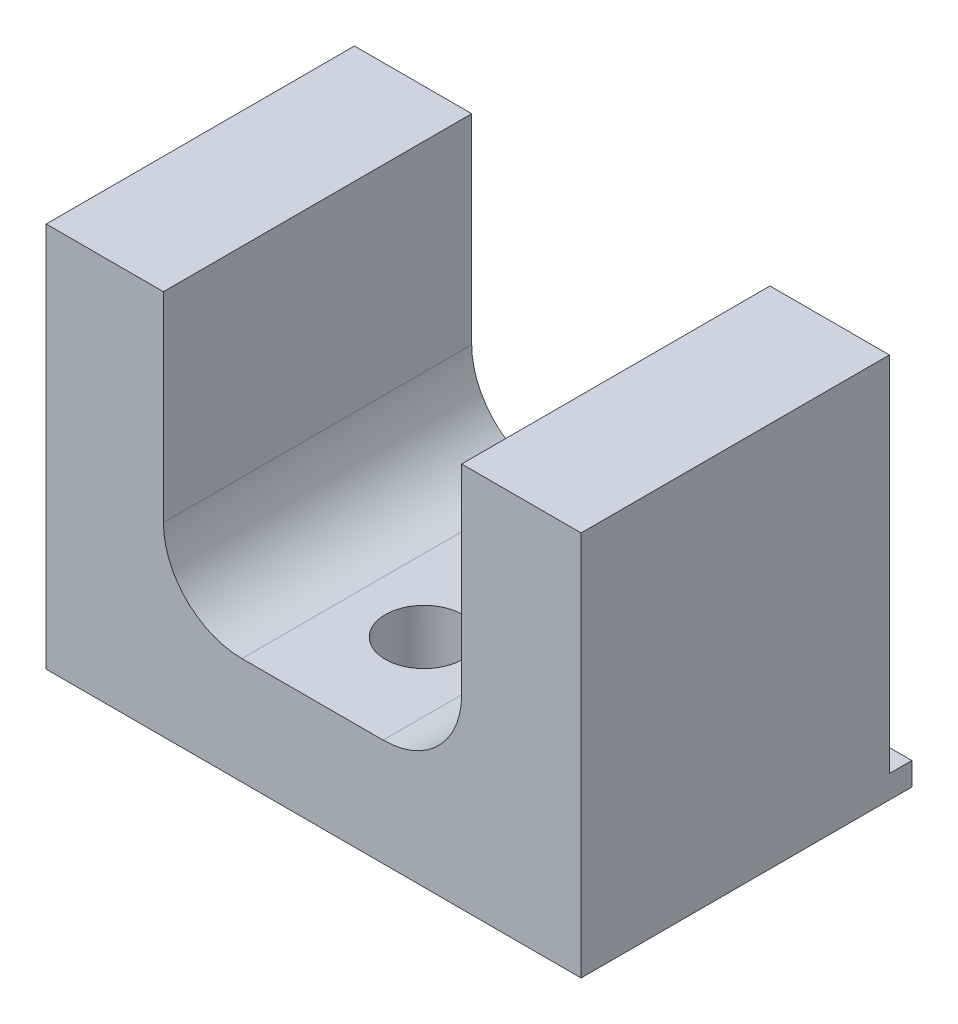
ISO-10303-21;
HEADER;
FILE_DESCRIPTION(('STEP AP214'),'2;1');
FILE_NAME('part.step','',(''),(''),'','','');
FILE_SCHEMA(('AUTOMOTIVE_DESIGN { 1 0 10303 214 1 1 1 1 }'));
ENDSEC;
DATA;
#1=APPLICATION_CONTEXT('core data for automotive mechanical design processes');
#2=APPLICATION_PROTOCOL_DEFINITION('international standard','automotive_design',2000,#1);
#3=PRODUCT_CONTEXT('',#1,'mechanical');
#4=PRODUCT('Part','Part','',(#3));
#5=PRODUCT_RELATED_PRODUCT_CATEGORY('part','',(#4));
#6=PRODUCT_DEFINITION_FORMATION('','',#4);
#7=PRODUCT_DEFINITION_CONTEXT('part definition',#1,'design');
#8=PRODUCT_DEFINITION('design','',#6,#7);
#9=PRODUCT_DEFINITION_SHAPE('','',#8);
#10=(LENGTH_UNIT() NAMED_UNIT(*) SI_UNIT(.MILLI.,.METRE.));
#11=(NAMED_UNIT(*) PLANE_ANGLE_UNIT() SI_UNIT($,.RADIAN.));
#12=(NAMED_UNIT(*) SI_UNIT($,.STERADIAN.) SOLID_ANGLE_UNIT());
#13=UNCERTAINTY_MEASURE_WITH_UNIT(LENGTH_MEASURE(1.E-05),#10,'distance_accuracy_value','');
#14=(GEOMETRIC_REPRESENTATION_CONTEXT(3) GLOBAL_UNCERTAINTY_ASSIGNED_CONTEXT((#13)) GLOBAL_UNIT_ASSIGNED_CONTEXT((#10,
#11,#12)) REPRESENTATION_CONTEXT('',''));
#15=CARTESIAN_POINT('',(0.,0.,0.));
#16=DIRECTION('',(0.,0.,1.));
#17=DIRECTION('',(1.,0.,0.));
#18=AXIS2_PLACEMENT_3D('',#15,#16,#17);
#19=CARTESIAN_POINT('',(0.,0.,-45.11));
#20=DIRECTION('',(-1.,0.,0.));
#21=DIRECTION('',(0.,0.,1.));
#22=AXIS2_PLACEMENT_3D('',#19,#20,#21);
#23=PLANE('',#22);
#24=DIRECTION('',(0.,0.,1.));
#25=VECTOR('',#24,1.);
#26=CARTESIAN_POINT('',(0.,52.58,-45.11));
#27=LINE('',#26,#25);
#28=CARTESIAN_POINT('',(0.,52.58,-42.05));
#29=VERTEX_POINT('',#28);
#30=CARTESIAN_POINT('',(0.,52.58,0.));
#31=VERTEX_POINT('',#30);
#32=EDGE_CURVE('E57',#29,#31,#27,.T.);
#33=ORIENTED_EDGE('',*,*,#32,.F.);
#34=DIRECTION('',(0.,-1.,0.));
#35=VECTOR('',#34,1.);
#36=CARTESIAN_POINT('',(0.,0.,-42.05));
#37=LINE('',#36,#35);
#38=CARTESIAN_POINT('',(0.,3.13,-42.05));
#39=VERTEX_POINT('',#38);
#40=EDGE_CURVE('E131',#29,#39,#37,.T.);
#41=ORIENTED_EDGE('',*,*,#40,.T.);
#42=DIRECTION('',(0.,0.,-1.));
#43=VECTOR('',#42,1.);
#44=CARTESIAN_POINT('',(0.,3.13,-45.11));
#45=LINE('',#44,#43);
#46=CARTESIAN_POINT('',(0.,3.13,-45.11));
#47=VERTEX_POINT('',#46);
#48=EDGE_CURVE('E326',#39,#47,#45,.T.);
#49=ORIENTED_EDGE('',*,*,#48,.T.);
#50=DIRECTION('',(0.,-1.,0.));
#51=VECTOR('',#50,1.);
#52=CARTESIAN_POINT('',(0.,0.,-45.11));
#53=LINE('',#52,#51);
#54=CARTESIAN_POINT('',(0.,0.,-45.11));
#55=VERTEX_POINT('',#54);
#56=EDGE_CURVE('E139',#47,#55,#53,.T.);
#57=ORIENTED_EDGE('',*,*,#56,.T.);
#58=DIRECTION('',(0.,0.,1.));
#59=VECTOR('',#58,1.);
#60=CARTESIAN_POINT('',(0.,0.,-45.11));
#61=LINE('',#60,#59);
#62=CARTESIAN_POINT('',(0.,0.,0.));
#63=VERTEX_POINT('',#62);
#64=EDGE_CURVE('E125',#55,#63,#61,.T.);
#65=ORIENTED_EDGE('',*,*,#64,.T.);
#66=DIRECTION('',(0.,-1.,0.));
#67=VECTOR('',#66,1.);
#68=CARTESIAN_POINT('',(0.,0.,0.));
#69=LINE('',#68,#67);
#70=EDGE_CURVE('E123',#31,#63,#69,.T.);
#71=ORIENTED_EDGE('',*,*,#70,.F.);
#72=EDGE_LOOP('',(#33,#41,#49,#57,#65,#71));
#73=FACE_BOUND('',#72,.T.);
#74=ADVANCED_FACE('F49',(#73),#23,.T.);
#75=CARTESIAN_POINT('',(0.,52.58,-45.11));
#76=DIRECTION('',(0.,1.,0.));
#77=DIRECTION('',(0.,0.,1.));
#78=AXIS2_PLACEMENT_3D('',#75,#76,#77);
#79=PLANE('',#78);
#80=DIRECTION('',(0.,0.,1.));
#81=VECTOR('',#80,1.);
#82=CARTESIAN_POINT('',(15.99,52.58,-45.11));
#83=LINE('',#82,#81);
#84=CARTESIAN_POINT('',(15.99,52.58,-42.05));
#85=VERTEX_POINT('',#84);
#86=CARTESIAN_POINT('',(15.99,52.58,0.));
#87=VERTEX_POINT('',#86);
#88=EDGE_CURVE('E120',#85,#87,#83,.T.);
#89=ORIENTED_EDGE('',*,*,#88,.F.);
#90=DIRECTION('',(-1.,0.,0.));
#91=VECTOR('',#90,1.);
#92=CARTESIAN_POINT('',(0.,52.58,-42.05));
#93=LINE('',#92,#91);
#94=EDGE_CURVE('E116',#85,#29,#93,.T.);
#95=ORIENTED_EDGE('',*,*,#94,.T.);
#96=ORIENTED_EDGE('',*,*,#32,.T.);
#97=DIRECTION('',(-1.,0.,0.));
#98=VECTOR('',#97,1.);
#99=CARTESIAN_POINT('',(0.,52.58,0.));
#100=LINE('',#99,#98);
#101=EDGE_CURVE('E114',#87,#31,#100,.T.);
#102=ORIENTED_EDGE('',*,*,#101,.F.);
#103=EDGE_LOOP('',(#89,#95,#96,#102));
#104=FACE_BOUND('',#103,.T.);
#105=ADVANCED_FACE('F112',(#104),#79,.T.);
#106=CARTESIAN_POINT('',(15.99,52.58,-45.11));
#107=DIRECTION('',(1.,0.,0.));
#108=DIRECTION('',(0.,1.,0.));
#109=AXIS2_PLACEMENT_3D('',#106,#107,#108);
#110=PLANE('',#109);
#111=DIRECTION('',(0.,0.,1.));
#112=VECTOR('',#111,1.);
#113=CARTESIAN_POINT('',(15.99,25.31,-45.11));
#114=LINE('',#113,#112);
#115=CARTESIAN_POINT('',(15.99,25.31,-42.05));
#116=VERTEX_POINT('',#115);
#117=CARTESIAN_POINT('',(15.99,25.31,0.));
#118=VERTEX_POINT('',#117);
#119=EDGE_CURVE('E151',#116,#118,#114,.T.);
#120=ORIENTED_EDGE('',*,*,#119,.F.);
#121=DIRECTION('',(0.,1.,0.));
#122=VECTOR('',#121,1.);
#123=CARTESIAN_POINT('',(15.99,52.58,-42.05));
#124=LINE('',#123,#122);
#125=EDGE_CURVE('E216',#116,#85,#124,.T.);
#126=ORIENTED_EDGE('',*,*,#125,.T.);
#127=ORIENTED_EDGE('',*,*,#88,.T.);
#128=DIRECTION('',(0.,1.,0.));
#129=VECTOR('',#128,1.);
#130=CARTESIAN_POINT('',(15.99,52.58,0.));
#131=LINE('',#130,#129);
#132=EDGE_CURVE('E137',#118,#87,#131,.T.);
#133=ORIENTED_EDGE('',*,*,#132,.F.);
#134=EDGE_LOOP('',(#120,#126,#127,#133));
#135=FACE_BOUND('',#134,.T.);
#136=ADVANCED_FACE('F213',(#135),#110,.T.);
#137=CARTESIAN_POINT('',(26.7,25.31,-45.11));
#138=DIRECTION('',(0.,0.,1.));
#139=DIRECTION('',(1.,0.,0.));
#140=AXIS2_PLACEMENT_3D('',#137,#138,#139);
#141=CYLINDRICAL_SURFACE('',#140,10.71);
#142=DIRECTION('',(0.,0.,1.));
#143=VECTOR('',#142,1.);
#144=CARTESIAN_POINT('',(26.7,14.6,-45.11));
#145=LINE('',#144,#143);
#146=CARTESIAN_POINT('',(26.7,14.6,-42.05));
#147=VERTEX_POINT('',#146);
#148=CARTESIAN_POINT('',(26.7,14.6,0.));
#149=VERTEX_POINT('',#148);
#150=EDGE_CURVE('E154',#147,#149,#145,.T.);
#151=ORIENTED_EDGE('',*,*,#150,.F.);
#152=CARTESIAN_POINT('',(26.7,25.31,-42.05));
#153=DIRECTION('',(0.,0.,-1.));
#154=DIRECTION('',(-1.,0.,0.));
#155=AXIS2_PLACEMENT_3D('',#152,#153,#154);
#156=CIRCLE('',#155,10.71);
#157=EDGE_CURVE('E210',#147,#116,#156,.T.);
#158=ORIENTED_EDGE('',*,*,#157,.T.);
#159=ORIENTED_EDGE('',*,*,#119,.T.);
#160=CARTESIAN_POINT('',(26.7,25.31,0.));
#161=DIRECTION('',(0.,0.,-1.));
#162=DIRECTION('',(1.,0.,0.));
#163=AXIS2_PLACEMENT_3D('',#160,#161,#162);
#164=CIRCLE('',#163,10.71);
#165=EDGE_CURVE('E145',#149,#118,#164,.T.);
#166=ORIENTED_EDGE('',*,*,#165,.F.);
#167=EDGE_LOOP('',(#151,#158,#159,#166));
#168=FACE_BOUND('',#167,.T.);
#169=ADVANCED_FACE('F204',(#168),#141,.F.);
#170=CARTESIAN_POINT('',(26.7,14.6,-45.11));
#171=DIRECTION('',(0.,1.,0.));
#172=DIRECTION('',(-1.,0.,0.));
#173=AXIS2_PLACEMENT_3D('',#170,#171,#172);
#174=PLANE('',#173);
#175=CARTESIAN_POINT('',(36.57,14.6,-14.97));
#176=DIRECTION('',(0.,1.,0.));
#177=DIRECTION('',(-1.,0.,0.));
#178=AXIS2_PLACEMENT_3D('',#175,#176,#177);
#179=CIRCLE('',#178,5.29);
#180=CARTESIAN_POINT('',(31.28,14.6,-14.97));
#181=VERTEX_POINT('',#180);
#182=EDGE_CURVE('E313',#181,#181,#179,.T.);
#183=ORIENTED_EDGE('',*,*,#182,.F.);
#184=EDGE_LOOP('',(#183));
#185=FACE_BOUND('',#184,.T.);
#186=DIRECTION('',(0.,0.,1.));
#187=VECTOR('',#186,1.);
#188=CARTESIAN_POINT('',(45.96,14.6,-45.11));
#189=LINE('',#188,#187);
#190=CARTESIAN_POINT('',(45.96,14.6,-42.05));
#191=VERTEX_POINT('',#190);
#192=CARTESIAN_POINT('',(45.96,14.6,0.));
#193=VERTEX_POINT('',#192);
#194=EDGE_CURVE('E157',#191,#193,#189,.T.);
#195=ORIENTED_EDGE('',*,*,#194,.F.);
#196=DIRECTION('',(-1.,0.,0.));
#197=VECTOR('',#196,1.);
#198=CARTESIAN_POINT('',(26.7,14.6,-42.05));
#199=LINE('',#198,#197);
#200=EDGE_CURVE('E342',#191,#147,#199,.T.);
#201=ORIENTED_EDGE('',*,*,#200,.T.);
#202=ORIENTED_EDGE('',*,*,#150,.T.);
#203=DIRECTION('',(-1.,0.,0.));
#204=VECTOR('',#203,1.);
#205=CARTESIAN_POINT('',(26.7,14.6,0.));
#206=LINE('',#205,#204);
#207=EDGE_CURVE('E196',#193,#149,#206,.T.);
#208=ORIENTED_EDGE('',*,*,#207,.F.);
#209=EDGE_LOOP('',(#195,#201,#202,#208));
#210=FACE_BOUND('',#209,.T.);
#211=ADVANCED_FACE('F378',(#185,#210),#174,.T.);
#212=CARTESIAN_POINT('',(45.96,25.31,-45.11));
#213=DIRECTION('',(0.,0.,1.));
#214=DIRECTION('',(1.,0.,0.));
#215=AXIS2_PLACEMENT_3D('',#212,#213,#214);
#216=CYLINDRICAL_SURFACE('',#215,10.71);
#217=DIRECTION('',(0.,0.,1.));
#218=VECTOR('',#217,1.);
#219=CARTESIAN_POINT('',(56.67,25.31,-45.11));
#220=LINE('',#219,#218);
#221=CARTESIAN_POINT('',(56.67,25.31,-42.05));
#222=VERTEX_POINT('',#221);
#223=CARTESIAN_POINT('',(56.67,25.31,0.));
#224=VERTEX_POINT('',#223);
#225=EDGE_CURVE('E160',#222,#224,#220,.T.);
#226=ORIENTED_EDGE('',*,*,#225,.F.);
#227=CARTESIAN_POINT('',(45.96,25.31,-42.05));
#228=DIRECTION('',(0.,0.,-1.));
#229=DIRECTION('',(-1.,0.,0.));
#230=AXIS2_PLACEMENT_3D('',#227,#228,#229);
#231=CIRCLE('',#230,10.71);
#232=EDGE_CURVE('E338',#222,#191,#231,.T.);
#233=ORIENTED_EDGE('',*,*,#232,.T.);
#234=ORIENTED_EDGE('',*,*,#194,.T.);
#235=CARTESIAN_POINT('',(45.96,25.31,0.));
#236=DIRECTION('',(0.,0.,-1.));
#237=DIRECTION('',(1.,0.,0.));
#238=AXIS2_PLACEMENT_3D('',#235,#236,#237);
#239=CIRCLE('',#238,10.71);
#240=EDGE_CURVE('E192',#224,#193,#239,.T.);
#241=ORIENTED_EDGE('',*,*,#240,.F.);
#242=EDGE_LOOP('',(#226,#233,#234,#241));
#243=FACE_BOUND('',#242,.T.);
#244=ADVANCED_FACE('F375',(#243),#216,.F.);
#245=CARTESIAN_POINT('',(56.67,25.31,-45.11));
#246=DIRECTION('',(-1.,0.,0.));
#247=DIRECTION('',(0.,-1.,0.));
#248=AXIS2_PLACEMENT_3D('',#245,#246,#247);
#249=PLANE('',#248);
#250=DIRECTION('',(0.,0.,1.));
#251=VECTOR('',#250,1.);
#252=CARTESIAN_POINT('',(56.67,52.57,-45.11));
#253=LINE('',#252,#251);
#254=CARTESIAN_POINT('',(56.67,52.57,-42.05));
#255=VERTEX_POINT('',#254);
#256=CARTESIAN_POINT('',(56.67,52.57,0.));
#257=VERTEX_POINT('',#256);
#258=EDGE_CURVE('E163',#255,#257,#253,.T.);
#259=ORIENTED_EDGE('',*,*,#258,.F.);
#260=DIRECTION('',(0.,-1.,0.));
#261=VECTOR('',#260,1.);
#262=CARTESIAN_POINT('',(56.67,25.31,-42.05));
#263=LINE('',#262,#261);
#264=EDGE_CURVE('E334',#255,#222,#263,.T.);
#265=ORIENTED_EDGE('',*,*,#264,.T.);
#266=ORIENTED_EDGE('',*,*,#225,.T.);
#267=DIRECTION('',(0.,-1.,0.));
#268=VECTOR('',#267,1.);
#269=CARTESIAN_POINT('',(56.67,25.31,0.));
#270=LINE('',#269,#268);
#271=EDGE_CURVE('E188',#257,#224,#270,.T.);
#272=ORIENTED_EDGE('',*,*,#271,.F.);
#273=EDGE_LOOP('',(#259,#265,#266,#272));
#274=FACE_BOUND('',#273,.T.);
#275=ADVANCED_FACE('F371',(#274),#249,.T.);
#276=CARTESIAN_POINT('',(56.67,52.57,-45.11));
#277=DIRECTION('',(0.,1.,0.));
#278=DIRECTION('',(0.,0.,1.));
#279=AXIS2_PLACEMENT_3D('',#276,#277,#278);
#280=PLANE('',#279);
#281=DIRECTION('',(0.,0.,1.));
#282=VECTOR('',#281,1.);
#283=CARTESIAN_POINT('',(72.96,52.57,-45.11));
#284=LINE('',#283,#282);
#285=CARTESIAN_POINT('',(72.96,52.57,-42.05));
#286=VERTEX_POINT('',#285);
#287=CARTESIAN_POINT('',(72.96,52.57,0.));
#288=VERTEX_POINT('',#287);
#289=EDGE_CURVE('E166',#286,#288,#284,.T.);
#290=ORIENTED_EDGE('',*,*,#289,.F.);
#291=DIRECTION('',(-1.,0.,0.));
#292=VECTOR('',#291,1.);
#293=CARTESIAN_POINT('',(56.67,52.57,-42.05));
#294=LINE('',#293,#292);
#295=EDGE_CURVE('E330',#286,#255,#294,.T.);
#296=ORIENTED_EDGE('',*,*,#295,.T.);
#297=ORIENTED_EDGE('',*,*,#258,.T.);
#298=DIRECTION('',(-1.,0.,0.));
#299=VECTOR('',#298,1.);
#300=CARTESIAN_POINT('',(56.67,52.57,0.));
#301=LINE('',#300,#299);
#302=EDGE_CURVE('E184',#288,#257,#301,.T.);
#303=ORIENTED_EDGE('',*,*,#302,.F.);
#304=EDGE_LOOP('',(#290,#296,#297,#303));
#305=FACE_BOUND('',#304,.T.);
#306=ADVANCED_FACE('F367',(#305),#280,.T.);
#307=CARTESIAN_POINT('',(72.96,52.57,-45.11));
#308=DIRECTION('',(1.,0.,0.));
#309=DIRECTION('',(0.,0.,-1.));
#310=AXIS2_PLACEMENT_3D('',#307,#308,#309);
#311=PLANE('',#310);
#312=DIRECTION('',(0.,0.,1.));
#313=VECTOR('',#312,1.);
#314=CARTESIAN_POINT('',(72.96,3.13,-45.11));
#315=LINE('',#314,#313);
#316=CARTESIAN_POINT('',(72.96,3.13,-45.11));
#317=VERTEX_POINT('',#316);
#318=CARTESIAN_POINT('',(72.96,3.13,-42.05));
#319=VERTEX_POINT('',#318);
#320=EDGE_CURVE('E63',#317,#319,#315,.T.);
#321=ORIENTED_EDGE('',*,*,#320,.T.);
#322=DIRECTION('',(0.,1.,0.));
#323=VECTOR('',#322,1.);
#324=CARTESIAN_POINT('',(72.96,52.57,-42.05));
#325=LINE('',#324,#323);
#326=EDGE_CURVE('E319',#319,#286,#325,.T.);
#327=ORIENTED_EDGE('',*,*,#326,.T.);
#328=ORIENTED_EDGE('',*,*,#289,.T.);
#329=DIRECTION('',(0.,1.,0.));
#330=VECTOR('',#329,1.);
#331=CARTESIAN_POINT('',(72.96,52.57,0.));
#332=LINE('',#331,#330);
#333=CARTESIAN_POINT('',(72.96,0.,0.));
#334=VERTEX_POINT('',#333);
#335=EDGE_CURVE('E180',#334,#288,#332,.T.);
#336=ORIENTED_EDGE('',*,*,#335,.F.);
#337=DIRECTION('',(0.,0.,1.));
#338=VECTOR('',#337,1.);
#339=CARTESIAN_POINT('',(72.96,0.,-45.11));
#340=LINE('',#339,#338);
#341=CARTESIAN_POINT('',(72.96,0.,-45.11));
#342=VERTEX_POINT('',#341);
#343=EDGE_CURVE('E72',#342,#334,#340,.T.);
#344=ORIENTED_EDGE('',*,*,#343,.F.);
#345=DIRECTION('',(0.,1.,0.));
#346=VECTOR('',#345,1.);
#347=CARTESIAN_POINT('',(72.96,52.57,-45.11));
#348=LINE('',#347,#346);
#349=EDGE_CURVE('E171',#342,#317,#348,.T.);
#350=ORIENTED_EDGE('',*,*,#349,.T.);
#351=EDGE_LOOP('',(#321,#327,#328,#336,#344,#350));
#352=FACE_BOUND('',#351,.T.);
#353=ADVANCED_FACE('F364',(#352),#311,.T.);
#354=CARTESIAN_POINT('',(26.7,25.31,-45.11));
#355=DIRECTION('',(0.,0.,1.));
#356=DIRECTION('',(1.,0.,0.));
#357=AXIS2_PLACEMENT_3D('',#354,#355,#356);
#358=PLANE('',#357);
#359=DIRECTION('',(-1.,0.,0.));
#360=VECTOR('',#359,1.);
#361=CARTESIAN_POINT('',(26.7,3.13,-45.11));
#362=LINE('',#361,#360);
#363=EDGE_CURVE('E11',#317,#47,#362,.T.);
#364=ORIENTED_EDGE('',*,*,#363,.F.);
#365=ORIENTED_EDGE('',*,*,#349,.F.);
#366=DIRECTION('',(1.,0.,0.));
#367=VECTOR('',#366,1.);
#368=CARTESIAN_POINT('',(0.,0.,-45.11));
#369=LINE('',#368,#367);
#370=EDGE_CURVE('E143',#55,#342,#369,.T.);
#371=ORIENTED_EDGE('',*,*,#370,.F.);
#372=ORIENTED_EDGE('',*,*,#56,.F.);
#373=EDGE_LOOP('',(#364,#365,#371,#372));
#374=FACE_BOUND('',#373,.T.);
#375=ADVANCED_FACE('F359',(#374),#358,.F.);
#376=CARTESIAN_POINT('',(0.,0.,-45.11));
#377=DIRECTION('',(0.,-1.,0.));
#378=DIRECTION('',(0.,0.,-1.));
#379=AXIS2_PLACEMENT_3D('',#376,#377,#378);
#380=PLANE('',#379);
#381=CARTESIAN_POINT('',(36.57,0.,-14.97));
#382=DIRECTION('',(0.,-1.,0.));
#383=DIRECTION('',(0.,0.,-1.));
#384=AXIS2_PLACEMENT_3D('',#381,#382,#383);
#385=CIRCLE('',#384,5.29);
#386=CARTESIAN_POINT('',(36.57,0.,-20.26));
#387=VERTEX_POINT('',#386);
#388=EDGE_CURVE('E309',#387,#387,#385,.T.);
#389=ORIENTED_EDGE('',*,*,#388,.F.);
#390=EDGE_LOOP('',(#389));
#391=FACE_BOUND('',#390,.T.);
#392=DIRECTION('',(1.,0.,0.));
#393=VECTOR('',#392,1.);
#394=CARTESIAN_POINT('',(0.,0.,0.));
#395=LINE('',#394,#393);
#396=EDGE_CURVE('E130',#63,#334,#395,.T.);
#397=ORIENTED_EDGE('',*,*,#396,.F.);
#398=ORIENTED_EDGE('',*,*,#64,.F.);
#399=ORIENTED_EDGE('',*,*,#370,.T.);
#400=ORIENTED_EDGE('',*,*,#343,.T.);
#401=EDGE_LOOP('',(#397,#398,#399,#400));
#402=FACE_BOUND('',#401,.T.);
#403=ADVANCED_FACE('F362',(#391,#402),#380,.T.);
#404=CARTESIAN_POINT('',(26.7,25.31,0.));
#405=DIRECTION('',(0.,0.,1.));
#406=DIRECTION('',(1.,0.,0.));
#407=AXIS2_PLACEMENT_3D('',#404,#405,#406);
#408=PLANE('',#407);
#409=ORIENTED_EDGE('',*,*,#70,.T.);
#410=ORIENTED_EDGE('',*,*,#396,.T.);
#411=ORIENTED_EDGE('',*,*,#335,.T.);
#412=ORIENTED_EDGE('',*,*,#302,.T.);
#413=ORIENTED_EDGE('',*,*,#271,.T.);
#414=ORIENTED_EDGE('',*,*,#240,.T.);
#415=ORIENTED_EDGE('',*,*,#207,.T.);
#416=ORIENTED_EDGE('',*,*,#165,.T.);
#417=ORIENTED_EDGE('',*,*,#132,.T.);
#418=ORIENTED_EDGE('',*,*,#101,.T.);
#419=EDGE_LOOP('',(#409,#410,#411,#412,#413,#414,#415,#416,#417,#418));
#420=FACE_BOUND('',#419,.T.);
#421=ADVANCED_FACE('F134',(#420),#408,.T.);
#422=CARTESIAN_POINT('',(-27.04,52.57,-42.05));
#423=DIRECTION('',(0.,0.,-1.));
#424=DIRECTION('',(-1.,0.,0.));
#425=AXIS2_PLACEMENT_3D('',#422,#423,#424);
#426=PLANE('',#425);
#427=CARTESIAN_POINT('',(62.965,42.405,-42.05));
#428=DIRECTION('',(0.,0.,-1.));
#429=DIRECTION('',(-1.,0.,0.));
#430=AXIS2_PLACEMENT_3D('',#427,#428,#429);
#431=CIRCLE('',#430,2.525);
#432=CARTESIAN_POINT('',(60.44,42.405,-42.05));
#433=VERTEX_POINT('',#432);
#434=EDGE_CURVE('E274',#433,#433,#431,.T.);
#435=ORIENTED_EDGE('',*,*,#434,.F.);
#436=EDGE_LOOP('',(#435));
#437=FACE_BOUND('',#436,.T.);
#438=CARTESIAN_POINT('',(62.965,7.5,-42.05));
#439=DIRECTION('',(0.,0.,-1.));
#440=DIRECTION('',(-1.,0.,0.));
#441=AXIS2_PLACEMENT_3D('',#438,#439,#440);
#442=CIRCLE('',#441,2.525);
#443=CARTESIAN_POINT('',(60.44,7.5,-42.05));
#444=VERTEX_POINT('',#443);
#445=EDGE_CURVE('E265',#444,#444,#442,.T.);
#446=ORIENTED_EDGE('',*,*,#445,.F.);
#447=EDGE_LOOP('',(#446));
#448=FACE_BOUND('',#447,.T.);
#449=CARTESIAN_POINT('',(10.06,7.5,-42.05));
#450=DIRECTION('',(0.,0.,-1.));
#451=DIRECTION('',(-1.,0.,0.));
#452=AXIS2_PLACEMENT_3D('',#449,#450,#451);
#453=CIRCLE('',#452,2.525);
#454=CARTESIAN_POINT('',(7.535,7.5,-42.05));
#455=VERTEX_POINT('',#454);
#456=EDGE_CURVE('E285',#455,#455,#453,.T.);
#457=ORIENTED_EDGE('',*,*,#456,.F.);
#458=EDGE_LOOP('',(#457));
#459=FACE_BOUND('',#458,.T.);
#460=CARTESIAN_POINT('',(10.06,42.405,-42.05));
#461=DIRECTION('',(0.,0.,-1.));
#462=DIRECTION('',(-1.,0.,0.));
#463=AXIS2_PLACEMENT_3D('',#460,#461,#462);
#464=CIRCLE('',#463,2.525);
#465=CARTESIAN_POINT('',(7.53500000000001,42.405,-42.05));
#466=VERTEX_POINT('',#465);
#467=EDGE_CURVE('E297',#466,#466,#464,.T.);
#468=ORIENTED_EDGE('',*,*,#467,.F.);
#469=EDGE_LOOP('',(#468));
#470=FACE_BOUND('',#469,.T.);
#471=ORIENTED_EDGE('',*,*,#94,.F.);
#472=ORIENTED_EDGE('',*,*,#125,.F.);
#473=ORIENTED_EDGE('',*,*,#157,.F.);
#474=ORIENTED_EDGE('',*,*,#200,.F.);
#475=ORIENTED_EDGE('',*,*,#232,.F.);
#476=ORIENTED_EDGE('',*,*,#264,.F.);
#477=ORIENTED_EDGE('',*,*,#295,.F.);
#478=ORIENTED_EDGE('',*,*,#326,.F.);
#479=DIRECTION('',(1.,0.,0.));
#480=VECTOR('',#479,1.);
#481=CARTESIAN_POINT('',(-27.04,3.13,-42.05));
#482=LINE('',#481,#480);
#483=EDGE_CURVE('E323',#39,#319,#482,.T.);
#484=ORIENTED_EDGE('',*,*,#483,.F.);
#485=ORIENTED_EDGE('',*,*,#40,.F.);
#486=EDGE_LOOP('',(#471,#472,#473,#474,#475,#476,#477,#478,#484,#485));
#487=FACE_BOUND('',#486,.T.);
#488=ADVANCED_FACE('F355',(#437,#448,#459,#470,#487),#426,.T.);
#489=CARTESIAN_POINT('',(-27.04,3.13,-45.11));
#490=DIRECTION('',(0.,1.,0.));
#491=DIRECTION('',(0.,0.,1.));
#492=AXIS2_PLACEMENT_3D('',#489,#490,#491);
#493=PLANE('',#492);
#494=ORIENTED_EDGE('',*,*,#483,.T.);
#495=ORIENTED_EDGE('',*,*,#320,.F.);
#496=ORIENTED_EDGE('',*,*,#363,.T.);
#497=ORIENTED_EDGE('',*,*,#48,.F.);
#498=EDGE_LOOP('',(#494,#495,#496,#497));
#499=FACE_BOUND('',#498,.T.);
#500=ADVANCED_FACE('F357',(#499),#493,.T.);
#501=CARTESIAN_POINT('',(36.57,100.,-14.97));
#502=DIRECTION('',(0.,-1.,0.));
#503=DIRECTION('',(0.,0.,-1.));
#504=AXIS2_PLACEMENT_3D('',#501,#502,#503);
#505=CYLINDRICAL_SURFACE('',#504,5.29);
#506=ORIENTED_EDGE('',*,*,#182,.T.);
#507=EDGE_LOOP('',(#506));
#508=FACE_BOUND('',#507,.T.);
#509=ORIENTED_EDGE('',*,*,#388,.T.);
#510=EDGE_LOOP('',(#509));
#511=FACE_BOUND('',#510,.T.);
#512=ADVANCED_FACE('F405',(#508,#511),#505,.F.);
#513=CARTESIAN_POINT('',(10.06,42.405,-14.19));
#514=DIRECTION('',(0.,0.,-1.));
#515=DIRECTION('',(-1.,0.,0.));
#516=AXIS2_PLACEMENT_3D('',#513,#514,#515);
#517=CONICAL_SURFACE('',#516,2.09999999999999,1.02974425867665);
#518=CARTESIAN_POINT('',(10.06,42.405,-12.9281927000421));
#519=VERTEX_POINT('',#518);
#520=VERTEX_LOOP('',#519);
#521=FACE_BOUND('',#520,.T.);
#522=CARTESIAN_POINT('',(10.06,42.405,-14.19));
#523=DIRECTION('',(0.,0.,-1.));
#524=DIRECTION('',(-1.,0.,0.));
#525=AXIS2_PLACEMENT_3D('',#522,#523,#524);
#526=CIRCLE('',#525,2.09999999999999);
#527=CARTESIAN_POINT('',(7.96000000000001,42.405,-14.19));
#528=VERTEX_POINT('',#527);
#529=EDGE_CURVE('E305',#528,#528,#526,.T.);
#530=ORIENTED_EDGE('',*,*,#529,.T.);
#531=EDGE_LOOP('',(#530));
#532=FACE_BOUND('',#531,.T.);
#533=ADVANCED_FACE('F411',(#521,#532),#517,.F.);
#534=CARTESIAN_POINT('',(10.06,42.405,-42.05));
#535=DIRECTION('',(0.,0.,-1.));
#536=DIRECTION('',(-1.,0.,0.));
#537=AXIS2_PLACEMENT_3D('',#534,#535,#536);
#538=CYLINDRICAL_SURFACE('',#537,2.1);
#539=ORIENTED_EDGE('',*,*,#529,.F.);
#540=EDGE_LOOP('',(#539));
#541=FACE_BOUND('',#540,.T.);
#542=CARTESIAN_POINT('',(10.06,42.405,-41.625));
#543=DIRECTION('',(0.,0.,-1.));
#544=DIRECTION('',(-1.,0.,0.));
#545=AXIS2_PLACEMENT_3D('',#542,#543,#544);
#546=CIRCLE('',#545,2.1);
#547=CARTESIAN_POINT('',(7.96000000000001,42.405,-41.625));
#548=VERTEX_POINT('',#547);
#549=EDGE_CURVE('E301',#548,#548,#546,.T.);
#550=ORIENTED_EDGE('',*,*,#549,.T.);
#551=EDGE_LOOP('',(#550));
#552=FACE_BOUND('',#551,.T.);
#553=ADVANCED_FACE('F415',(#541,#552),#538,.F.);
#554=CARTESIAN_POINT('',(10.06,42.405,-42.05));
#555=DIRECTION('',(0.,0.,-1.));
#556=DIRECTION('',(-1.,0.,0.));
#557=AXIS2_PLACEMENT_3D('',#554,#555,#556);
#558=CONICAL_SURFACE('',#557,2.525,0.785398163397448);
#559=ORIENTED_EDGE('',*,*,#549,.F.);
#560=EDGE_LOOP('',(#559));
#561=FACE_BOUND('',#560,.T.);
#562=ORIENTED_EDGE('',*,*,#467,.T.);
#563=EDGE_LOOP('',(#562));
#564=FACE_BOUND('',#563,.T.);
#565=ADVANCED_FACE('F419',(#561,#564),#558,.F.);
#566=CARTESIAN_POINT('',(10.06,7.5,-14.19));
#567=DIRECTION('',(0.,0.,-1.));
#568=DIRECTION('',(-1.,0.,0.));
#569=AXIS2_PLACEMENT_3D('',#566,#567,#568);
#570=CONICAL_SURFACE('',#569,2.09999999999999,1.02974425867665);
#571=CARTESIAN_POINT('',(10.06,7.5,-12.9281927000421));
#572=VERTEX_POINT('',#571);
#573=VERTEX_LOOP('',#572);
#574=FACE_BOUND('',#573,.T.);
#575=CARTESIAN_POINT('',(10.06,7.5,-14.19));
#576=DIRECTION('',(0.,0.,-1.));
#577=DIRECTION('',(-1.,0.,0.));
#578=AXIS2_PLACEMENT_3D('',#575,#576,#577);
#579=CIRCLE('',#578,2.09999999999999);
#580=CARTESIAN_POINT('',(7.96000000000001,7.5,-14.19));
#581=VERTEX_POINT('',#580);
#582=EDGE_CURVE('E293',#581,#581,#579,.T.);
#583=ORIENTED_EDGE('',*,*,#582,.T.);
#584=EDGE_LOOP('',(#583));
#585=FACE_BOUND('',#584,.T.);
#586=ADVANCED_FACE('F423',(#574,#585),#570,.F.);
#587=CARTESIAN_POINT('',(10.06,7.5,-42.05));
#588=DIRECTION('',(0.,0.,-1.));
#589=DIRECTION('',(-1.,0.,0.));
#590=AXIS2_PLACEMENT_3D('',#587,#588,#589);
#591=CYLINDRICAL_SURFACE('',#590,2.1);
#592=ORIENTED_EDGE('',*,*,#582,.F.);
#593=EDGE_LOOP('',(#592));
#594=FACE_BOUND('',#593,.T.);
#595=CARTESIAN_POINT('',(10.06,7.5,-41.625));
#596=DIRECTION('',(0.,0.,-1.));
#597=DIRECTION('',(-1.,0.,0.));
#598=AXIS2_PLACEMENT_3D('',#595,#596,#597);
#599=CIRCLE('',#598,2.1);
#600=CARTESIAN_POINT('',(7.96,7.5,-41.625));
#601=VERTEX_POINT('',#600);
#602=EDGE_CURVE('E289',#601,#601,#599,.T.);
#603=ORIENTED_EDGE('',*,*,#602,.T.);
#604=EDGE_LOOP('',(#603));
#605=FACE_BOUND('',#604,.T.);
#606=ADVANCED_FACE('F427',(#594,#605),#591,.F.);
#607=CARTESIAN_POINT('',(10.06,7.5,-42.05));
#608=DIRECTION('',(0.,0.,-1.));
#609=DIRECTION('',(-1.,0.,0.));
#610=AXIS2_PLACEMENT_3D('',#607,#608,#609);
#611=CONICAL_SURFACE('',#610,2.525,0.785398163397448);
#612=ORIENTED_EDGE('',*,*,#602,.F.);
#613=EDGE_LOOP('',(#612));
#614=FACE_BOUND('',#613,.T.);
#615=ORIENTED_EDGE('',*,*,#456,.T.);
#616=EDGE_LOOP('',(#615));
#617=FACE_BOUND('',#616,.T.);
#618=ADVANCED_FACE('F431',(#614,#617),#611,.F.);
#619=CARTESIAN_POINT('',(62.965,7.5,-14.19));
#620=DIRECTION('',(0.,0.,-1.));
#621=DIRECTION('',(-1.,0.,0.));
#622=AXIS2_PLACEMENT_3D('',#619,#620,#621);
#623=CONICAL_SURFACE('',#622,2.09999999999999,1.02974425867665);
#624=CARTESIAN_POINT('',(62.965,7.5,-12.9281927000421));
#625=VERTEX_POINT('',#624);
#626=VERTEX_LOOP('',#625);
#627=FACE_BOUND('',#626,.T.);
#628=CARTESIAN_POINT('',(62.965,7.5,-14.19));
#629=DIRECTION('',(0.,0.,-1.));
#630=DIRECTION('',(-1.,0.,0.));
#631=AXIS2_PLACEMENT_3D('',#628,#629,#630);
#632=CIRCLE('',#631,2.09999999999999);
#633=CARTESIAN_POINT('',(60.865,7.5,-14.19));
#634=VERTEX_POINT('',#633);
#635=EDGE_CURVE('E281',#634,#634,#632,.T.);
#636=ORIENTED_EDGE('',*,*,#635,.T.);
#637=EDGE_LOOP('',(#636));
#638=FACE_BOUND('',#637,.T.);
#639=ADVANCED_FACE('F435',(#627,#638),#623,.F.);
#640=CARTESIAN_POINT('',(62.965,7.5,-42.05));
#641=DIRECTION('',(0.,0.,-1.));
#642=DIRECTION('',(-1.,0.,0.));
#643=AXIS2_PLACEMENT_3D('',#640,#641,#642);
#644=CYLINDRICAL_SURFACE('',#643,2.1);
#645=ORIENTED_EDGE('',*,*,#635,.F.);
#646=EDGE_LOOP('',(#645));
#647=FACE_BOUND('',#646,.T.);
#648=CARTESIAN_POINT('',(62.965,7.5,-41.625));
#649=DIRECTION('',(0.,0.,-1.));
#650=DIRECTION('',(-1.,0.,0.));
#651=AXIS2_PLACEMENT_3D('',#648,#649,#650);
#652=CIRCLE('',#651,2.1);
#653=CARTESIAN_POINT('',(60.865,7.5,-41.625));
#654=VERTEX_POINT('',#653);
#655=EDGE_CURVE('E271',#654,#654,#652,.T.);
#656=ORIENTED_EDGE('',*,*,#655,.T.);
#657=EDGE_LOOP('',(#656));
#658=FACE_BOUND('',#657,.T.);
#659=ADVANCED_FACE('F439',(#647,#658),#644,.F.);
#660=CARTESIAN_POINT('',(62.965,7.5,-42.05));
#661=DIRECTION('',(0.,0.,-1.));
#662=DIRECTION('',(-1.,0.,0.));
#663=AXIS2_PLACEMENT_3D('',#660,#661,#662);
#664=CONICAL_SURFACE('',#663,2.525,0.78539816339744);
#665=ORIENTED_EDGE('',*,*,#655,.F.);
#666=EDGE_LOOP('',(#665));
#667=FACE_BOUND('',#666,.T.);
#668=ORIENTED_EDGE('',*,*,#445,.T.);
#669=EDGE_LOOP('',(#668));
#670=FACE_BOUND('',#669,.T.);
#671=ADVANCED_FACE('F258',(#667,#670),#664,.F.);
#672=CARTESIAN_POINT('',(62.965,42.405,-14.19));
#673=DIRECTION('',(0.,0.,-1.));
#674=DIRECTION('',(-1.,0.,0.));
#675=AXIS2_PLACEMENT_3D('',#672,#673,#674);
#676=CONICAL_SURFACE('',#675,2.09999999999999,1.02974425867665);
#677=CARTESIAN_POINT('',(62.965,42.405,-12.9281927000421));
#678=VERTEX_POINT('',#677);
#679=VERTEX_LOOP('',#678);
#680=FACE_BOUND('',#679,.T.);
#681=CARTESIAN_POINT('',(62.965,42.405,-14.19));
#682=DIRECTION('',(0.,0.,-1.));
#683=DIRECTION('',(-1.,0.,0.));
#684=AXIS2_PLACEMENT_3D('',#681,#682,#683);
#685=CIRCLE('',#684,2.09999999999999);
#686=CARTESIAN_POINT('',(60.865,42.405,-14.19));
#687=VERTEX_POINT('',#686);
#688=EDGE_CURVE('E262',#687,#687,#685,.T.);
#689=ORIENTED_EDGE('',*,*,#688,.T.);
#690=EDGE_LOOP('',(#689));
#691=FACE_BOUND('',#690,.T.);
#692=ADVANCED_FACE('F254',(#680,#691),#676,.F.);
#693=CARTESIAN_POINT('',(62.965,42.405,-42.05));
#694=DIRECTION('',(0.,0.,-1.));
#695=DIRECTION('',(-1.,0.,0.));
#696=AXIS2_PLACEMENT_3D('',#693,#694,#695);
#697=CYLINDRICAL_SURFACE('',#696,2.1);
#698=ORIENTED_EDGE('',*,*,#688,.F.);
#699=EDGE_LOOP('',(#698));
#700=FACE_BOUND('',#699,.T.);
#701=CARTESIAN_POINT('',(62.965,42.405,-41.625));
#702=DIRECTION('',(0.,0.,-1.));
#703=DIRECTION('',(-1.,0.,0.));
#704=AXIS2_PLACEMENT_3D('',#701,#702,#703);
#705=CIRCLE('',#704,2.1);
#706=CARTESIAN_POINT('',(60.865,42.405,-41.625));
#707=VERTEX_POINT('',#706);
#708=EDGE_CURVE('E266',#707,#707,#705,.T.);
#709=ORIENTED_EDGE('',*,*,#708,.T.);
#710=EDGE_LOOP('',(#709));
#711=FACE_BOUND('',#710,.T.);
#712=ADVANCED_FACE('F257',(#700,#711),#697,.F.);
#713=CARTESIAN_POINT('',(62.965,42.405,-42.05));
#714=DIRECTION('',(0.,0.,-1.));
#715=DIRECTION('',(-1.,0.,0.));
#716=AXIS2_PLACEMENT_3D('',#713,#714,#715);
#717=CONICAL_SURFACE('',#716,2.525,0.78539816339744);
#718=ORIENTED_EDGE('',*,*,#708,.F.);
#719=EDGE_LOOP('',(#718));
#720=FACE_BOUND('',#719,.T.);
#721=ORIENTED_EDGE('',*,*,#434,.T.);
#722=EDGE_LOOP('',(#721));
#723=FACE_BOUND('',#722,.T.);
#724=ADVANCED_FACE('F449',(#720,#723),#717,.F.);
#725=CLOSED_SHELL('',(#74,#105,#136,#169,#211,#244,#275,#306,#353,#375,#403,#421,#488,#500,#512,
#533,#553,#565,#586,#606,#618,#639,#659,#671,#692,#712,#724));
#726=MANIFOLD_SOLID_BREP('B2',#725);
#727=ADVANCED_BREP_SHAPE_REPRESENTATION('',(#18,#726),#14);
#728=SHAPE_DEFINITION_REPRESENTATION(#9,#727);
ENDSEC;
END-ISO-10303-21;
